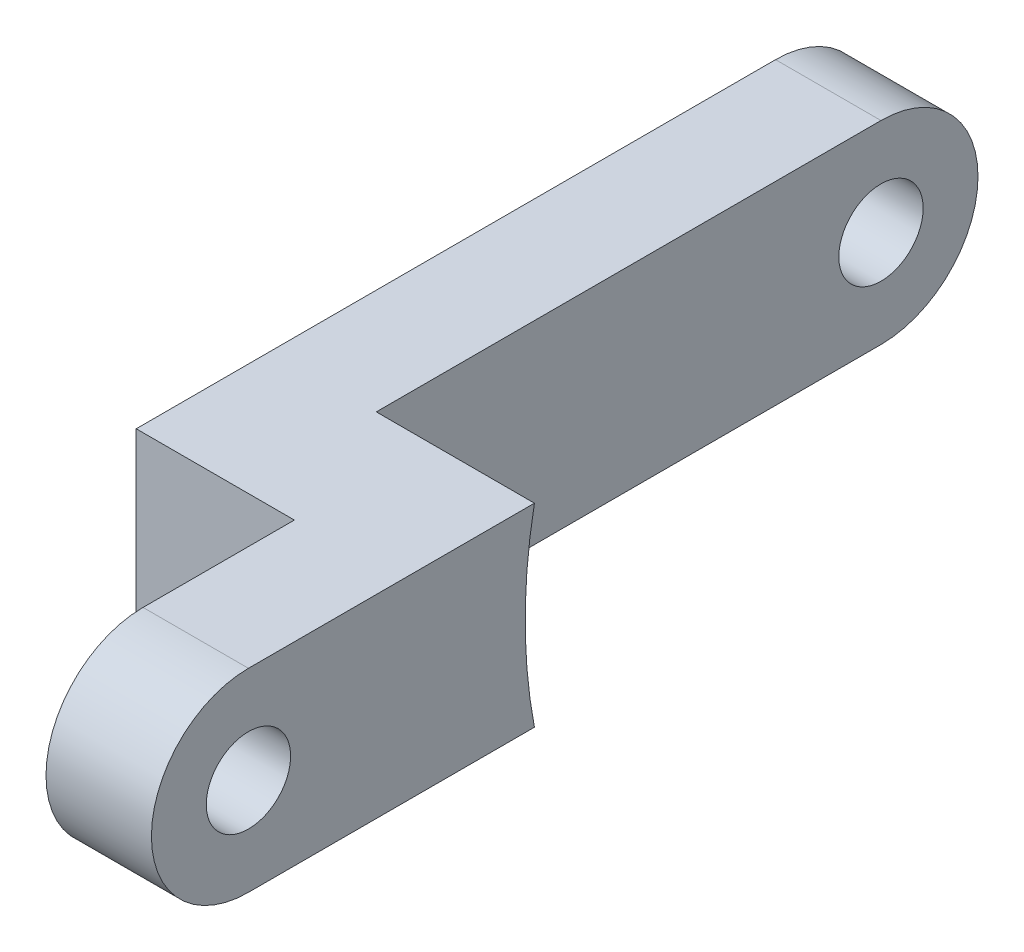
ISO-10303-21;
HEADER;
FILE_DESCRIPTION(('STEP AP214'),'2;1');
FILE_NAME('part.step','',(''),(''),'','','');
FILE_SCHEMA(('AUTOMOTIVE_DESIGN { 1 0 10303 214 1 1 1 1 }'));
ENDSEC;
DATA;
#1=APPLICATION_CONTEXT('core data for automotive mechanical design processes');
#2=APPLICATION_PROTOCOL_DEFINITION('international standard','automotive_design',2000,#1);
#3=PRODUCT_CONTEXT('',#1,'mechanical');
#4=PRODUCT('Part','Part','',(#3));
#5=PRODUCT_RELATED_PRODUCT_CATEGORY('part','',(#4));
#6=PRODUCT_DEFINITION_FORMATION('','',#4);
#7=PRODUCT_DEFINITION_CONTEXT('part definition',#1,'design');
#8=PRODUCT_DEFINITION('design','',#6,#7);
#9=PRODUCT_DEFINITION_SHAPE('','',#8);
#10=(LENGTH_UNIT() NAMED_UNIT(*) SI_UNIT(.MILLI.,.METRE.));
#11=(NAMED_UNIT(*) PLANE_ANGLE_UNIT() SI_UNIT($,.RADIAN.));
#12=(NAMED_UNIT(*) SI_UNIT($,.STERADIAN.) SOLID_ANGLE_UNIT());
#13=UNCERTAINTY_MEASURE_WITH_UNIT(LENGTH_MEASURE(1.E-05),#10,'distance_accuracy_value','');
#14=(GEOMETRIC_REPRESENTATION_CONTEXT(3) GLOBAL_UNCERTAINTY_ASSIGNED_CONTEXT((#13)) GLOBAL_UNIT_ASSIGNED_CONTEXT((#10,
#11,#12)) REPRESENTATION_CONTEXT('',''));
#15=CARTESIAN_POINT('',(0.,0.,0.));
#16=DIRECTION('',(0.,0.,1.));
#17=DIRECTION('',(1.,0.,0.));
#18=AXIS2_PLACEMENT_3D('',#15,#16,#17);
#19=CARTESIAN_POINT('',(-24.,-99.0745151724357,0.));
#20=DIRECTION('',(0.,-1.,0.));
#21=DIRECTION('',(0.,0.,-1.));
#22=AXIS2_PLACEMENT_3D('',#19,#20,#21);
#23=PLANE('',#22);
#24=DIRECTION('',(0.,0.,-1.));
#25=VECTOR('',#24,1.);
#26=CARTESIAN_POINT('',(-28.,-99.0745151724357,0.));
#27=LINE('',#26,#25);
#28=CARTESIAN_POINT('',(-28.,-99.0745151724357,64.6832253494522));
#29=VERTEX_POINT('',#28);
#30=CARTESIAN_POINT('',(-28.,-99.0745151724357,58.9413144498074));
#31=VERTEX_POINT('',#30);
#32=EDGE_CURVE('E115',#29,#31,#27,.T.);
#33=ORIENTED_EDGE('',*,*,#32,.F.);
#34=DIRECTION('',(-1.,0.,0.));
#35=VECTOR('',#34,1.);
#36=CARTESIAN_POINT('',(-24.,-99.0745151724357,64.6832253494522));
#37=LINE('',#36,#35);
#38=CARTESIAN_POINT('',(-24.,-99.0745151724357,64.6832253494522));
#39=VERTEX_POINT('',#38);
#40=EDGE_CURVE('E11',#39,#29,#37,.T.);
#41=ORIENTED_EDGE('',*,*,#40,.F.);
#42=DIRECTION('',(0.,0.,1.));
#43=VECTOR('',#42,1.);
#44=CARTESIAN_POINT('',(-24.,-99.0745151724357,0.));
#45=LINE('',#44,#43);
#46=CARTESIAN_POINT('',(-24.,-99.0745151724357,53.8325544598587));
#47=VERTEX_POINT('',#46);
#48=EDGE_CURVE('E134',#47,#39,#45,.T.);
#49=ORIENTED_EDGE('',*,*,#48,.F.);
#50=DIRECTION('',(1.,0.,0.));
#51=VECTOR('',#50,1.);
#52=CARTESIAN_POINT('',(-30.,-99.0745151724357,53.8325544598587));
#53=LINE('',#52,#51);
#54=CARTESIAN_POINT('',(-30.,-99.0745151724357,53.8325544598587));
#55=VERTEX_POINT('',#54);
#56=EDGE_CURVE('E164',#47,#55,#53,.F.);
#57=ORIENTED_EDGE('',*,*,#56,.T.);
#58=DIRECTION('',(0.,0.,1.));
#59=VECTOR('',#58,1.);
#60=CARTESIAN_POINT('',(-30.,-99.0745151724357,0.));
#61=LINE('',#60,#59);
#62=CARTESIAN_POINT('',(-30.,-99.0745151724357,34.6832253494522));
#63=VERTEX_POINT('',#62);
#64=EDGE_CURVE('E167',#63,#55,#61,.T.);
#65=ORIENTED_EDGE('',*,*,#64,.F.);
#66=DIRECTION('',(-1.,0.,0.));
#67=VECTOR('',#66,1.);
#68=CARTESIAN_POINT('',(-24.,-99.0745151724357,34.6832253494522));
#69=LINE('',#68,#67);
#70=CARTESIAN_POINT('',(-34.,-99.0745151724357,34.6832253494522));
#71=VERTEX_POINT('',#70);
#72=EDGE_CURVE('E133',#63,#71,#69,.T.);
#73=ORIENTED_EDGE('',*,*,#72,.T.);
#74=DIRECTION('',(0.,0.,1.));
#75=VECTOR('',#74,1.);
#76=CARTESIAN_POINT('',(-34.,-99.0745151724357,0.));
#77=LINE('',#76,#75);
#78=CARTESIAN_POINT('',(-34.,-99.0745151724357,58.9413144498074));
#79=VERTEX_POINT('',#78);
#80=EDGE_CURVE('E143',#71,#79,#77,.T.);
#81=ORIENTED_EDGE('',*,*,#80,.T.);
#82=DIRECTION('',(-1.,0.,0.));
#83=VECTOR('',#82,1.);
#84=CARTESIAN_POINT('',(-28.,-99.0745151724357,58.9413144498074));
#85=LINE('',#84,#83);
#86=EDGE_CURVE('E60',#31,#79,#85,.T.);
#87=ORIENTED_EDGE('',*,*,#86,.F.);
#88=EDGE_LOOP('',(#33,#41,#49,#57,#65,#73,#81,#87));
#89=FACE_BOUND('',#88,.T.);
#90=ADVANCED_FACE('F43',(#89),#23,.F.);
#91=CARTESIAN_POINT('',(-24.,-106.437447909149,0.));
#92=DIRECTION('',(0.,-1.,0.));
#93=DIRECTION('',(0.,0.,-1.));
#94=AXIS2_PLACEMENT_3D('',#91,#92,#93);
#95=PLANE('',#94);
#96=DIRECTION('',(0.,0.,1.));
#97=VECTOR('',#96,1.);
#98=CARTESIAN_POINT('',(-28.,-106.437447909149,0.));
#99=LINE('',#98,#97);
#100=CARTESIAN_POINT('',(-28.,-106.437447909149,58.9413144498074));
#101=VERTEX_POINT('',#100);
#102=CARTESIAN_POINT('',(-28.,-106.437447909149,64.6832253494522));
#103=VERTEX_POINT('',#102);
#104=EDGE_CURVE('E111',#101,#103,#99,.T.);
#105=ORIENTED_EDGE('',*,*,#104,.F.);
#106=DIRECTION('',(-1.,0.,0.));
#107=VECTOR('',#106,1.);
#108=CARTESIAN_POINT('',(-28.,-106.437447909149,58.9413144498074));
#109=LINE('',#108,#107);
#110=CARTESIAN_POINT('',(-34.,-106.437447909149,58.9413144498074));
#111=VERTEX_POINT('',#110);
#112=EDGE_CURVE('E161',#101,#111,#109,.T.);
#113=ORIENTED_EDGE('',*,*,#112,.T.);
#114=DIRECTION('',(0.,0.,1.));
#115=VECTOR('',#114,1.);
#116=CARTESIAN_POINT('',(-34.,-106.437447909149,0.));
#117=LINE('',#116,#115);
#118=CARTESIAN_POINT('',(-34.,-106.437447909149,34.6832253494522));
#119=VERTEX_POINT('',#118);
#120=EDGE_CURVE('E141',#119,#111,#117,.T.);
#121=ORIENTED_EDGE('',*,*,#120,.F.);
#122=DIRECTION('',(-1.,0.,0.));
#123=VECTOR('',#122,1.);
#124=CARTESIAN_POINT('',(-24.,-106.437447909149,34.6832253494522));
#125=LINE('',#124,#123);
#126=CARTESIAN_POINT('',(-30.,-106.437447909149,34.6832253494522));
#127=VERTEX_POINT('',#126);
#128=EDGE_CURVE('E147',#127,#119,#125,.T.);
#129=ORIENTED_EDGE('',*,*,#128,.F.);
#130=DIRECTION('',(0.,0.,1.));
#131=VECTOR('',#130,1.);
#132=CARTESIAN_POINT('',(-30.,-106.437447909149,0.));
#133=LINE('',#132,#131);
#134=CARTESIAN_POINT('',(-30.,-106.437447909149,53.8325544598587));
#135=VERTEX_POINT('',#134);
#136=EDGE_CURVE('E63',#127,#135,#133,.T.);
#137=ORIENTED_EDGE('',*,*,#136,.T.);
#138=DIRECTION('',(1.,0.,0.));
#139=VECTOR('',#138,1.);
#140=CARTESIAN_POINT('',(-30.,-106.437447909149,53.8325544598587));
#141=LINE('',#140,#139);
#142=CARTESIAN_POINT('',(-24.,-106.437447909149,53.8325544598587));
#143=VERTEX_POINT('',#142);
#144=EDGE_CURVE('E154',#143,#135,#141,.F.);
#145=ORIENTED_EDGE('',*,*,#144,.F.);
#146=DIRECTION('',(0.,0.,1.));
#147=VECTOR('',#146,1.);
#148=CARTESIAN_POINT('',(-24.,-106.437447909149,0.));
#149=LINE('',#148,#147);
#150=CARTESIAN_POINT('',(-24.,-106.437447909149,64.6832253494522));
#151=VERTEX_POINT('',#150);
#152=EDGE_CURVE('E135',#143,#151,#149,.T.);
#153=ORIENTED_EDGE('',*,*,#152,.T.);
#154=DIRECTION('',(-1.,0.,0.));
#155=VECTOR('',#154,1.);
#156=CARTESIAN_POINT('',(-24.,-106.437447909149,64.6832253494522));
#157=LINE('',#156,#155);
#158=EDGE_CURVE('E49',#151,#103,#157,.T.);
#159=ORIENTED_EDGE('',*,*,#158,.T.);
#160=EDGE_LOOP('',(#105,#113,#121,#129,#137,#145,#153,#159));
#161=FACE_BOUND('',#160,.T.);
#162=ADVANCED_FACE('F155',(#161),#95,.T.);
#163=CARTESIAN_POINT('',(-24.,-102.755981540792,64.6832253494522));
#164=DIRECTION('',(-1.,0.,0.));
#165=DIRECTION('',(0.,0.,1.));
#166=AXIS2_PLACEMENT_3D('',#163,#164,#165);
#167=CYLINDRICAL_SURFACE('',#166,1.60000000000001);
#168=CARTESIAN_POINT('',(-24.,-102.755981540792,64.6832253494522));
#169=DIRECTION('',(-1.,0.,0.));
#170=DIRECTION('',(0.,0.,1.));
#171=AXIS2_PLACEMENT_3D('',#168,#169,#170);
#172=CIRCLE('',#171,1.60000000000001);
#173=CARTESIAN_POINT('',(-24.,-102.755981540792,66.2832253494522));
#174=VERTEX_POINT('',#173);
#175=EDGE_CURVE('E145',#174,#174,#172,.T.);
#176=ORIENTED_EDGE('',*,*,#175,.F.);
#177=EDGE_LOOP('',(#176));
#178=FACE_BOUND('',#177,.T.);
#179=CARTESIAN_POINT('',(-28.,-102.755981540792,64.6832253494522));
#180=DIRECTION('',(-1.,0.,0.));
#181=DIRECTION('',(0.,0.,1.));
#182=AXIS2_PLACEMENT_3D('',#179,#180,#181);
#183=CIRCLE('',#182,1.60000000000001);
#184=CARTESIAN_POINT('',(-28.,-102.755981540792,66.2832253494522));
#185=VERTEX_POINT('',#184);
#186=EDGE_CURVE('E119',#185,#185,#183,.F.);
#187=ORIENTED_EDGE('',*,*,#186,.F.);
#188=EDGE_LOOP('',(#187));
#189=FACE_BOUND('',#188,.T.);
#190=ADVANCED_FACE('F178',(#178,#189),#167,.F.);
#191=CARTESIAN_POINT('',(-24.,-102.755981540792,34.6832253494522));
#192=DIRECTION('',(-1.,0.,0.));
#193=DIRECTION('',(0.,0.,1.));
#194=AXIS2_PLACEMENT_3D('',#191,#192,#193);
#195=CYLINDRICAL_SURFACE('',#194,3.68146636835649);
#196=ORIENTED_EDGE('',*,*,#72,.F.);
#197=CARTESIAN_POINT('',(-30.,-102.755981540792,34.6832253494522));
#198=DIRECTION('',(1.,0.,0.));
#199=DIRECTION('',(0.,0.,-1.));
#200=AXIS2_PLACEMENT_3D('',#197,#198,#199);
#201=CIRCLE('',#200,3.68146636835649);
#202=EDGE_CURVE('E196',#63,#127,#201,.F.);
#203=ORIENTED_EDGE('',*,*,#202,.T.);
#204=ORIENTED_EDGE('',*,*,#128,.T.);
#205=CARTESIAN_POINT('',(-34.,-102.755981540792,34.6832253494522));
#206=DIRECTION('',(-1.,0.,0.));
#207=DIRECTION('',(0.,0.,1.));
#208=AXIS2_PLACEMENT_3D('',#205,#206,#207);
#209=CIRCLE('',#208,3.68146636835649);
#210=EDGE_CURVE('E140',#71,#119,#209,.T.);
#211=ORIENTED_EDGE('',*,*,#210,.F.);
#212=EDGE_LOOP('',(#196,#203,#204,#211));
#213=FACE_BOUND('',#212,.T.);
#214=ADVANCED_FACE('F185',(#213),#195,.T.);
#215=CARTESIAN_POINT('',(-24.,-102.755981540792,64.6832253494522));
#216=DIRECTION('',(-1.,0.,0.));
#217=DIRECTION('',(0.,0.,1.));
#218=AXIS2_PLACEMENT_3D('',#215,#216,#217);
#219=PLANE('',#218);
#220=ORIENTED_EDGE('',*,*,#175,.T.);
#221=EDGE_LOOP('',(#220));
#222=FACE_BOUND('',#221,.T.);
#223=CARTESIAN_POINT('',(-24.,-102.755981540792,34.6832253494522));
#224=DIRECTION('',(1.,0.,0.));
#225=DIRECTION('',(0.,0.,-1.));
#226=AXIS2_PLACEMENT_3D('',#223,#224,#225);
#227=CIRCLE('',#226,19.5);
#228=EDGE_CURVE('E158',#47,#143,#227,.T.);
#229=ORIENTED_EDGE('',*,*,#228,.F.);
#230=ORIENTED_EDGE('',*,*,#48,.T.);
#231=CARTESIAN_POINT('',(-24.,-102.755981540792,64.6832253494522));
#232=DIRECTION('',(-1.,0.,0.));
#233=DIRECTION('',(0.,0.,1.));
#234=AXIS2_PLACEMENT_3D('',#231,#232,#233);
#235=CIRCLE('',#234,3.68146636835646);
#236=EDGE_CURVE('E129',#151,#39,#235,.T.);
#237=ORIENTED_EDGE('',*,*,#236,.F.);
#238=ORIENTED_EDGE('',*,*,#152,.F.);
#239=EDGE_LOOP('',(#229,#230,#237,#238));
#240=FACE_BOUND('',#239,.T.);
#241=ADVANCED_FACE('F160',(#222,#240),#219,.F.);
#242=CARTESIAN_POINT('',(-24.,-102.755981540792,34.6832253494522));
#243=DIRECTION('',(-1.,0.,0.));
#244=DIRECTION('',(0.,0.,1.));
#245=AXIS2_PLACEMENT_3D('',#242,#243,#244);
#246=CYLINDRICAL_SURFACE('',#245,1.6);
#247=CARTESIAN_POINT('',(-34.,-102.755981540792,34.6832253494522));
#248=DIRECTION('',(-1.,0.,0.));
#249=DIRECTION('',(0.,0.,1.));
#250=AXIS2_PLACEMENT_3D('',#247,#248,#249);
#251=CIRCLE('',#250,1.6);
#252=CARTESIAN_POINT('',(-34.,-102.755981540792,36.2832253494522));
#253=VERTEX_POINT('',#252);
#254=EDGE_CURVE('E166',#253,#253,#251,.T.);
#255=ORIENTED_EDGE('',*,*,#254,.T.);
#256=EDGE_LOOP('',(#255));
#257=FACE_BOUND('',#256,.T.);
#258=CARTESIAN_POINT('',(-30.,-102.755981540792,34.6832253494522));
#259=DIRECTION('',(1.,0.,0.));
#260=DIRECTION('',(0.,0.,-1.));
#261=AXIS2_PLACEMENT_3D('',#258,#259,#260);
#262=CIRCLE('',#261,1.6);
#263=CARTESIAN_POINT('',(-30.,-102.755981540792,33.0832253494522));
#264=VERTEX_POINT('',#263);
#265=EDGE_CURVE('E198',#264,#264,#262,.F.);
#266=ORIENTED_EDGE('',*,*,#265,.F.);
#267=EDGE_LOOP('',(#266));
#268=FACE_BOUND('',#267,.T.);
#269=ADVANCED_FACE('F223',(#257,#268),#246,.F.);
#270=CARTESIAN_POINT('',(-24.,-102.755981540792,64.6832253494522));
#271=DIRECTION('',(-1.,0.,0.));
#272=DIRECTION('',(0.,0.,1.));
#273=AXIS2_PLACEMENT_3D('',#270,#271,#272);
#274=CYLINDRICAL_SURFACE('',#273,3.68146636835646);
#275=CARTESIAN_POINT('',(-28.,-102.755981540792,64.6832253494522));
#276=DIRECTION('',(-1.,0.,0.));
#277=DIRECTION('',(0.,0.,1.));
#278=AXIS2_PLACEMENT_3D('',#275,#276,#277);
#279=CIRCLE('',#278,3.68146636835646);
#280=EDGE_CURVE('E107',#103,#29,#279,.T.);
#281=ORIENTED_EDGE('',*,*,#280,.F.);
#282=ORIENTED_EDGE('',*,*,#158,.F.);
#283=ORIENTED_EDGE('',*,*,#236,.T.);
#284=ORIENTED_EDGE('',*,*,#40,.T.);
#285=EDGE_LOOP('',(#281,#282,#283,#284));
#286=FACE_BOUND('',#285,.T.);
#287=ADVANCED_FACE('F130',(#286),#274,.T.);
#288=CARTESIAN_POINT('',(-34.,-102.755981540792,64.6832253494522));
#289=DIRECTION('',(-1.,0.,0.));
#290=DIRECTION('',(0.,0.,1.));
#291=AXIS2_PLACEMENT_3D('',#288,#289,#290);
#292=PLANE('',#291);
#293=DIRECTION('',(0.,-1.,0.));
#294=VECTOR('',#293,1.);
#295=CARTESIAN_POINT('',(-34.,0.,58.9413144498074));
#296=LINE('',#295,#294);
#297=EDGE_CURVE('E190',#79,#111,#296,.T.);
#298=ORIENTED_EDGE('',*,*,#297,.F.);
#299=ORIENTED_EDGE('',*,*,#80,.F.);
#300=ORIENTED_EDGE('',*,*,#210,.T.);
#301=ORIENTED_EDGE('',*,*,#120,.T.);
#302=EDGE_LOOP('',(#298,#299,#300,#301));
#303=FACE_BOUND('',#302,.T.);
#304=ORIENTED_EDGE('',*,*,#254,.F.);
#305=EDGE_LOOP('',(#304));
#306=FACE_BOUND('',#305,.T.);
#307=ADVANCED_FACE('F204',(#303,#306),#292,.T.);
#308=CARTESIAN_POINT('',(-30.,-102.755981540792,34.6832253494522));
#309=DIRECTION('',(1.,0.,0.));
#310=DIRECTION('',(0.,0.,-1.));
#311=AXIS2_PLACEMENT_3D('',#308,#309,#310);
#312=CYLINDRICAL_SURFACE('',#311,19.5);
#313=ORIENTED_EDGE('',*,*,#228,.T.);
#314=ORIENTED_EDGE('',*,*,#144,.T.);
#315=CARTESIAN_POINT('',(-30.,-102.755981540792,34.6832253494522));
#316=DIRECTION('',(1.,0.,0.));
#317=DIRECTION('',(0.,0.,-1.));
#318=AXIS2_PLACEMENT_3D('',#315,#316,#317);
#319=CIRCLE('',#318,19.5);
#320=EDGE_CURVE('E159',#55,#135,#319,.T.);
#321=ORIENTED_EDGE('',*,*,#320,.F.);
#322=ORIENTED_EDGE('',*,*,#56,.F.);
#323=EDGE_LOOP('',(#313,#314,#321,#322));
#324=FACE_BOUND('',#323,.T.);
#325=ADVANCED_FACE('F205',(#324),#312,.F.);
#326=CARTESIAN_POINT('',(-30.,0.,0.));
#327=DIRECTION('',(1.,0.,0.));
#328=DIRECTION('',(0.,0.,-1.));
#329=AXIS2_PLACEMENT_3D('',#326,#327,#328);
#330=PLANE('',#329);
#331=ORIENTED_EDGE('',*,*,#265,.T.);
#332=EDGE_LOOP('',(#331));
#333=FACE_BOUND('',#332,.T.);
#334=ORIENTED_EDGE('',*,*,#64,.T.);
#335=ORIENTED_EDGE('',*,*,#320,.T.);
#336=ORIENTED_EDGE('',*,*,#136,.F.);
#337=ORIENTED_EDGE('',*,*,#202,.F.);
#338=EDGE_LOOP('',(#334,#335,#336,#337));
#339=FACE_BOUND('',#338,.T.);
#340=ADVANCED_FACE('F203',(#333,#339),#330,.T.);
#341=CARTESIAN_POINT('',(-28.,0.,58.9413144498074));
#342=DIRECTION('',(0.,0.,-1.));
#343=DIRECTION('',(-1.,0.,0.));
#344=AXIS2_PLACEMENT_3D('',#341,#342,#343);
#345=PLANE('',#344);
#346=ORIENTED_EDGE('',*,*,#297,.T.);
#347=ORIENTED_EDGE('',*,*,#112,.F.);
#348=DIRECTION('',(0.,-1.,0.));
#349=VECTOR('',#348,1.);
#350=CARTESIAN_POINT('',(-28.,0.,58.9413144498074));
#351=LINE('',#350,#349);
#352=EDGE_CURVE('E124',#31,#101,#351,.T.);
#353=ORIENTED_EDGE('',*,*,#352,.F.);
#354=ORIENTED_EDGE('',*,*,#86,.T.);
#355=EDGE_LOOP('',(#346,#347,#353,#354));
#356=FACE_BOUND('',#355,.T.);
#357=ADVANCED_FACE('F209',(#356),#345,.F.);
#358=CARTESIAN_POINT('',(-28.,0.,0.));
#359=DIRECTION('',(-1.,0.,0.));
#360=DIRECTION('',(0.,0.,1.));
#361=AXIS2_PLACEMENT_3D('',#358,#359,#360);
#362=PLANE('',#361);
#363=ORIENTED_EDGE('',*,*,#186,.T.);
#364=EDGE_LOOP('',(#363));
#365=FACE_BOUND('',#364,.T.);
#366=ORIENTED_EDGE('',*,*,#280,.T.);
#367=ORIENTED_EDGE('',*,*,#32,.T.);
#368=ORIENTED_EDGE('',*,*,#352,.T.);
#369=ORIENTED_EDGE('',*,*,#104,.T.);
#370=EDGE_LOOP('',(#366,#367,#368,#369));
#371=FACE_BOUND('',#370,.T.);
#372=ADVANCED_FACE('F109',(#365,#371),#362,.T.);
#373=CLOSED_SHELL('',(#90,#162,#190,#214,#241,#269,#287,#307,#325,#340,#357,#372));
#374=MANIFOLD_SOLID_BREP('B2',#373);
#375=ADVANCED_BREP_SHAPE_REPRESENTATION('',(#18,#374),#14);
#376=SHAPE_DEFINITION_REPRESENTATION(#9,#375);
ENDSEC;
END-ISO-10303-21;
